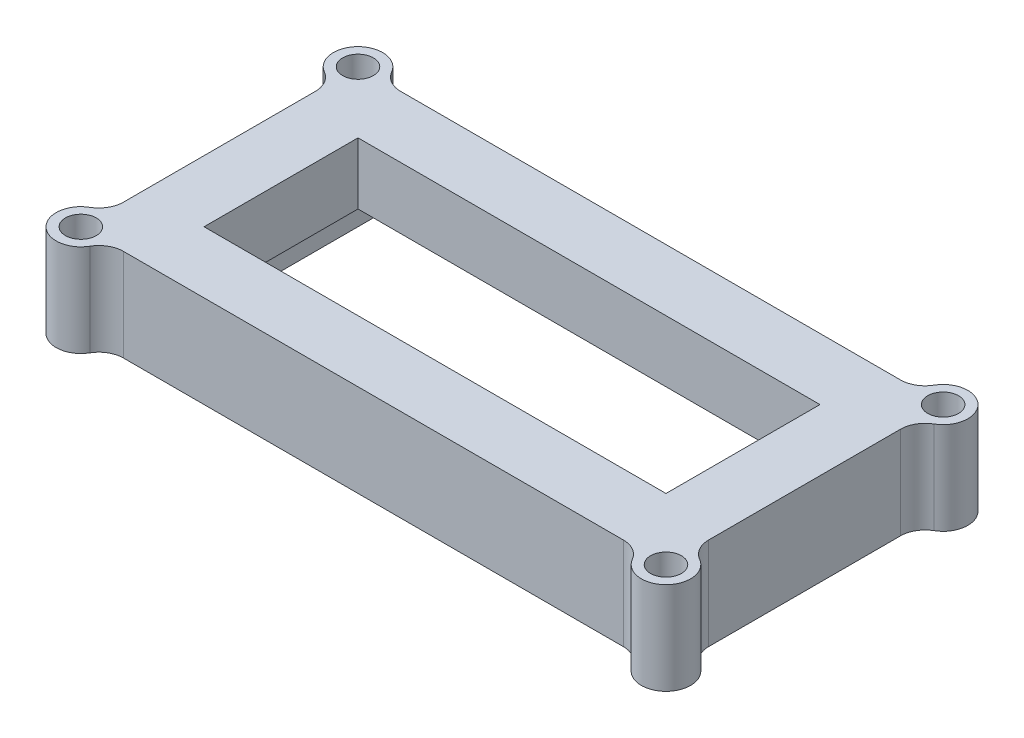
ISO-10303-21;
HEADER;
FILE_DESCRIPTION(('STEP AP214'),'2;1');
FILE_NAME('part.step','',(''),(''),'','','');
FILE_SCHEMA(('AUTOMOTIVE_DESIGN { 1 0 10303 214 1 1 1 1 }'));
ENDSEC;
DATA;
#1=APPLICATION_CONTEXT('core data for automotive mechanical design processes');
#2=APPLICATION_PROTOCOL_DEFINITION('international standard','automotive_design',2000,#1);
#3=PRODUCT_CONTEXT('',#1,'mechanical');
#4=PRODUCT('Part','Part','',(#3));
#5=PRODUCT_RELATED_PRODUCT_CATEGORY('part','',(#4));
#6=PRODUCT_DEFINITION_FORMATION('','',#4);
#7=PRODUCT_DEFINITION_CONTEXT('part definition',#1,'design');
#8=PRODUCT_DEFINITION('design','',#6,#7);
#9=PRODUCT_DEFINITION_SHAPE('','',#8);
#10=(LENGTH_UNIT() NAMED_UNIT(*) SI_UNIT(.MILLI.,.METRE.));
#11=(NAMED_UNIT(*) PLANE_ANGLE_UNIT() SI_UNIT($,.RADIAN.));
#12=(NAMED_UNIT(*) SI_UNIT($,.STERADIAN.) SOLID_ANGLE_UNIT());
#13=UNCERTAINTY_MEASURE_WITH_UNIT(LENGTH_MEASURE(1.E-05),#10,'distance_accuracy_value','');
#14=(GEOMETRIC_REPRESENTATION_CONTEXT(3) GLOBAL_UNCERTAINTY_ASSIGNED_CONTEXT((#13)) GLOBAL_UNIT_ASSIGNED_CONTEXT((#10,
#11,#12)) REPRESENTATION_CONTEXT('',''));
#15=CARTESIAN_POINT('',(0.,0.,0.));
#16=DIRECTION('',(0.,0.,1.));
#17=DIRECTION('',(1.,0.,0.));
#18=AXIS2_PLACEMENT_3D('',#15,#16,#17);
#19=CARTESIAN_POINT('',(0.,15.,-12.5));
#20=DIRECTION('',(0.,0.,-1.));
#21=DIRECTION('',(-1.,0.,0.));
#22=AXIS2_PLACEMENT_3D('',#19,#20,#21);
#23=PLANE('',#22);
#24=DIRECTION('',(-1.,0.,0.));
#25=VECTOR('',#24,1.);
#26=CARTESIAN_POINT('',(0.,5.,-12.5));
#27=LINE('',#26,#25);
#28=CARTESIAN_POINT('',(37.5,5.,-12.5));
#29=VERTEX_POINT('',#28);
#30=CARTESIAN_POINT('',(-37.5,5.,-12.5));
#31=VERTEX_POINT('',#30);
#32=EDGE_CURVE('E56',#29,#31,#27,.T.);
#33=ORIENTED_EDGE('',*,*,#32,.F.);
#34=DIRECTION('',(0.,-1.,0.));
#35=VECTOR('',#34,1.);
#36=CARTESIAN_POINT('',(37.5,15.,-12.5));
#37=LINE('',#36,#35);
#38=CARTESIAN_POINT('',(37.5,15.,-12.5));
#39=VERTEX_POINT('',#38);
#40=EDGE_CURVE('E345',#39,#29,#37,.T.);
#41=ORIENTED_EDGE('',*,*,#40,.F.);
#42=DIRECTION('',(1.,0.,0.));
#43=VECTOR('',#42,1.);
#44=CARTESIAN_POINT('',(0.,15.,-12.5));
#45=LINE('',#44,#43);
#46=CARTESIAN_POINT('',(-37.5,15.,-12.5));
#47=VERTEX_POINT('',#46);
#48=EDGE_CURVE('E292',#47,#39,#45,.T.);
#49=ORIENTED_EDGE('',*,*,#48,.F.);
#50=DIRECTION('',(0.,-1.,0.));
#51=VECTOR('',#50,1.);
#52=CARTESIAN_POINT('',(-37.5,15.,-12.5));
#53=LINE('',#52,#51);
#54=EDGE_CURVE('E303',#47,#31,#53,.T.);
#55=ORIENTED_EDGE('',*,*,#54,.T.);
#56=EDGE_LOOP('',(#33,#41,#49,#55));
#57=FACE_BOUND('',#56,.T.);
#58=ADVANCED_FACE('F41',(#57),#23,.F.);
#59=CARTESIAN_POINT('',(37.5,15.,0.));
#60=DIRECTION('',(1.,0.,0.));
#61=DIRECTION('',(0.,0.,-1.));
#62=AXIS2_PLACEMENT_3D('',#59,#60,#61);
#63=PLANE('',#62);
#64=DIRECTION('',(0.,0.,-1.));
#65=VECTOR('',#64,1.);
#66=CARTESIAN_POINT('',(37.5,5.,0.));
#67=LINE('',#66,#65);
#68=CARTESIAN_POINT('',(37.5,5.,12.5));
#69=VERTEX_POINT('',#68);
#70=EDGE_CURVE('E242',#69,#29,#67,.T.);
#71=ORIENTED_EDGE('',*,*,#70,.F.);
#72=DIRECTION('',(0.,-1.,0.));
#73=VECTOR('',#72,1.);
#74=CARTESIAN_POINT('',(37.5,15.,12.5));
#75=LINE('',#74,#73);
#76=CARTESIAN_POINT('',(37.5,15.,12.5));
#77=VERTEX_POINT('',#76);
#78=EDGE_CURVE('E342',#77,#69,#75,.T.);
#79=ORIENTED_EDGE('',*,*,#78,.F.);
#80=DIRECTION('',(0.,0.,1.));
#81=VECTOR('',#80,1.);
#82=CARTESIAN_POINT('',(37.5,15.,0.));
#83=LINE('',#82,#81);
#84=EDGE_CURVE('E295',#39,#77,#83,.T.);
#85=ORIENTED_EDGE('',*,*,#84,.F.);
#86=ORIENTED_EDGE('',*,*,#40,.T.);
#87=EDGE_LOOP('',(#71,#79,#85,#86));
#88=FACE_BOUND('',#87,.T.);
#89=ADVANCED_FACE('F460',(#88),#63,.F.);
#90=CARTESIAN_POINT('',(0.,15.,12.5));
#91=DIRECTION('',(0.,0.,-1.));
#92=DIRECTION('',(-1.,0.,0.));
#93=AXIS2_PLACEMENT_3D('',#90,#91,#92);
#94=PLANE('',#93);
#95=ORIENTED_EDGE('',*,*,#78,.T.);
#96=DIRECTION('',(-1.,0.,0.));
#97=VECTOR('',#96,1.);
#98=CARTESIAN_POINT('',(0.,5.,12.5));
#99=LINE('',#98,#97);
#100=CARTESIAN_POINT('',(-37.5,5.,12.5));
#101=VERTEX_POINT('',#100);
#102=EDGE_CURVE('E236',#69,#101,#99,.T.);
#103=ORIENTED_EDGE('',*,*,#102,.T.);
#104=DIRECTION('',(0.,-1.,0.));
#105=VECTOR('',#104,1.);
#106=CARTESIAN_POINT('',(-37.5,15.,12.5));
#107=LINE('',#106,#105);
#108=CARTESIAN_POINT('',(-37.5,15.,12.5));
#109=VERTEX_POINT('',#108);
#110=EDGE_CURVE('E339',#109,#101,#107,.T.);
#111=ORIENTED_EDGE('',*,*,#110,.F.);
#112=DIRECTION('',(1.,0.,0.));
#113=VECTOR('',#112,1.);
#114=CARTESIAN_POINT('',(0.,15.,12.5));
#115=LINE('',#114,#113);
#116=EDGE_CURVE('E297',#109,#77,#115,.T.);
#117=ORIENTED_EDGE('',*,*,#116,.T.);
#118=EDGE_LOOP('',(#95,#103,#111,#117));
#119=FACE_BOUND('',#118,.T.);
#120=ADVANCED_FACE('F455',(#119),#94,.T.);
#121=CARTESIAN_POINT('',(-37.5,15.,0.));
#122=DIRECTION('',(1.,0.,0.));
#123=DIRECTION('',(0.,0.,-1.));
#124=AXIS2_PLACEMENT_3D('',#121,#122,#123);
#125=PLANE('',#124);
#126=ORIENTED_EDGE('',*,*,#110,.T.);
#127=DIRECTION('',(0.,0.,-1.));
#128=VECTOR('',#127,1.);
#129=CARTESIAN_POINT('',(-37.5,5.,0.));
#130=LINE('',#129,#128);
#131=EDGE_CURVE('E11',#101,#31,#130,.T.);
#132=ORIENTED_EDGE('',*,*,#131,.T.);
#133=ORIENTED_EDGE('',*,*,#54,.F.);
#134=DIRECTION('',(0.,0.,1.));
#135=VECTOR('',#134,1.);
#136=CARTESIAN_POINT('',(-37.5,15.,0.));
#137=LINE('',#136,#135);
#138=EDGE_CURVE('E300',#47,#109,#137,.T.);
#139=ORIENTED_EDGE('',*,*,#138,.T.);
#140=EDGE_LOOP('',(#126,#132,#133,#139));
#141=FACE_BOUND('',#140,.T.);
#142=ADVANCED_FACE('F445',(#141),#125,.T.);
#143=CARTESIAN_POINT('',(47.5,15.,-22.5));
#144=DIRECTION('',(0.,-1.,0.));
#145=DIRECTION('',(0.,0.,-1.));
#146=AXIS2_PLACEMENT_3D('',#143,#144,#145);
#147=CYLINDRICAL_SURFACE('',#146,1.5);
#148=CARTESIAN_POINT('',(47.5,0.,-22.5));
#149=DIRECTION('',(0.,1.,0.));
#150=DIRECTION('',(0.,0.,1.));
#151=AXIS2_PLACEMENT_3D('',#148,#149,#150);
#152=CIRCLE('',#151,1.5);
#153=CARTESIAN_POINT('',(47.5,0.,-21.));
#154=VERTEX_POINT('',#153);
#155=EDGE_CURVE('E274',#154,#154,#152,.F.);
#156=ORIENTED_EDGE('',*,*,#155,.T.);
#157=EDGE_LOOP('',(#156));
#158=FACE_BOUND('',#157,.T.);
#159=CARTESIAN_POINT('',(47.5,5.,-22.5));
#160=DIRECTION('',(0.,1.,0.));
#161=DIRECTION('',(0.,0.,1.));
#162=AXIS2_PLACEMENT_3D('',#159,#160,#161);
#163=CIRCLE('',#162,1.5);
#164=CARTESIAN_POINT('',(47.5,5.,-21.));
#165=VERTEX_POINT('',#164);
#166=EDGE_CURVE('E308',#165,#165,#163,.F.);
#167=ORIENTED_EDGE('',*,*,#166,.F.);
#168=EDGE_LOOP('',(#167));
#169=FACE_BOUND('',#168,.T.);
#170=ADVANCED_FACE('F442',(#158,#169),#147,.F.);
#171=CARTESIAN_POINT('',(-47.5,15.,-22.5));
#172=DIRECTION('',(0.,-1.,0.));
#173=DIRECTION('',(0.,0.,-1.));
#174=AXIS2_PLACEMENT_3D('',#171,#172,#173);
#175=CYLINDRICAL_SURFACE('',#174,1.5);
#176=CARTESIAN_POINT('',(-47.5,0.,-22.5));
#177=DIRECTION('',(0.,1.,0.));
#178=DIRECTION('',(0.,0.,1.));
#179=AXIS2_PLACEMENT_3D('',#176,#177,#178);
#180=CIRCLE('',#179,1.5);
#181=CARTESIAN_POINT('',(-47.5,0.,-21.));
#182=VERTEX_POINT('',#181);
#183=EDGE_CURVE('E332',#182,#182,#180,.T.);
#184=ORIENTED_EDGE('',*,*,#183,.F.);
#185=EDGE_LOOP('',(#184));
#186=FACE_BOUND('',#185,.T.);
#187=CARTESIAN_POINT('',(-47.5,5.,-22.5));
#188=DIRECTION('',(0.,1.,0.));
#189=DIRECTION('',(0.,0.,1.));
#190=AXIS2_PLACEMENT_3D('',#187,#188,#189);
#191=CIRCLE('',#190,1.5);
#192=CARTESIAN_POINT('',(-47.5,5.,-21.));
#193=VERTEX_POINT('',#192);
#194=EDGE_CURVE('E435',#193,#193,#191,.T.);
#195=ORIENTED_EDGE('',*,*,#194,.T.);
#196=EDGE_LOOP('',(#195));
#197=FACE_BOUND('',#196,.T.);
#198=ADVANCED_FACE('F444',(#186,#197),#175,.F.);
#199=CARTESIAN_POINT('',(-47.5,15.,22.5));
#200=DIRECTION('',(0.,-1.,0.));
#201=DIRECTION('',(0.,0.,-1.));
#202=AXIS2_PLACEMENT_3D('',#199,#200,#201);
#203=CYLINDRICAL_SURFACE('',#202,1.5);
#204=CARTESIAN_POINT('',(-47.5,0.,22.5));
#205=DIRECTION('',(0.,1.,0.));
#206=DIRECTION('',(0.,0.,1.));
#207=AXIS2_PLACEMENT_3D('',#204,#205,#206);
#208=CIRCLE('',#207,1.5);
#209=CARTESIAN_POINT('',(-47.5,0.,24.));
#210=VERTEX_POINT('',#209);
#211=EDGE_CURVE('E329',#210,#210,#208,.F.);
#212=ORIENTED_EDGE('',*,*,#211,.T.);
#213=EDGE_LOOP('',(#212));
#214=FACE_BOUND('',#213,.T.);
#215=CARTESIAN_POINT('',(-47.5,5.,22.5));
#216=DIRECTION('',(0.,1.,0.));
#217=DIRECTION('',(0.,0.,1.));
#218=AXIS2_PLACEMENT_3D('',#215,#216,#217);
#219=CIRCLE('',#218,1.5);
#220=CARTESIAN_POINT('',(-47.5,5.,24.));
#221=VERTEX_POINT('',#220);
#222=EDGE_CURVE('E432',#221,#221,#219,.F.);
#223=ORIENTED_EDGE('',*,*,#222,.F.);
#224=EDGE_LOOP('',(#223));
#225=FACE_BOUND('',#224,.T.);
#226=ADVANCED_FACE('F452',(#214,#225),#203,.F.);
#227=CARTESIAN_POINT('',(47.5,15.,22.5));
#228=DIRECTION('',(0.,-1.,0.));
#229=DIRECTION('',(0.,0.,-1.));
#230=AXIS2_PLACEMENT_3D('',#227,#228,#229);
#231=CYLINDRICAL_SURFACE('',#230,1.5);
#232=CARTESIAN_POINT('',(47.5,0.,22.5));
#233=DIRECTION('',(0.,1.,0.));
#234=DIRECTION('',(0.,0.,1.));
#235=AXIS2_PLACEMENT_3D('',#232,#233,#234);
#236=CIRCLE('',#235,1.5);
#237=CARTESIAN_POINT('',(47.5,0.,24.));
#238=VERTEX_POINT('',#237);
#239=EDGE_CURVE('E304',#238,#238,#236,.T.);
#240=ORIENTED_EDGE('',*,*,#239,.F.);
#241=EDGE_LOOP('',(#240));
#242=FACE_BOUND('',#241,.T.);
#243=CARTESIAN_POINT('',(47.5,5.,22.5));
#244=DIRECTION('',(0.,1.,0.));
#245=DIRECTION('',(0.,0.,1.));
#246=AXIS2_PLACEMENT_3D('',#243,#244,#245);
#247=CIRCLE('',#246,1.5);
#248=CARTESIAN_POINT('',(47.5,5.,24.));
#249=VERTEX_POINT('',#248);
#250=EDGE_CURVE('E267',#249,#249,#247,.T.);
#251=ORIENTED_EDGE('',*,*,#250,.T.);
#252=EDGE_LOOP('',(#251));
#253=FACE_BOUND('',#252,.T.);
#254=ADVANCED_FACE('F632',(#242,#253),#231,.F.);
#255=CARTESIAN_POINT('',(-51.5,15.,15.5717967697245));
#256=DIRECTION('',(0.,-1.,0.));
#257=DIRECTION('',(0.,0.,-1.));
#258=AXIS2_PLACEMENT_3D('',#255,#256,#257);
#259=CYLINDRICAL_SURFACE('',#258,4.);
#260=DIRECTION('',(0.,-1.,0.));
#261=VECTOR('',#260,1.);
#262=CARTESIAN_POINT('',(-47.5,15.,15.5717967697245));
#263=LINE('',#262,#261);
#264=CARTESIAN_POINT('',(-47.5,0.,15.5717967697245));
#265=VERTEX_POINT('',#264);
#266=CARTESIAN_POINT('',(-47.5,15.,15.5717967697245));
#267=VERTEX_POINT('',#266);
#268=EDGE_CURVE('E421',#265,#267,#263,.F.);
#269=ORIENTED_EDGE('',*,*,#268,.F.);
#270=CARTESIAN_POINT('',(-51.5,0.,15.5717967697245));
#271=DIRECTION('',(0.,1.,0.));
#272=DIRECTION('',(0.,0.,1.));
#273=AXIS2_PLACEMENT_3D('',#270,#271,#272);
#274=CIRCLE('',#273,4.);
#275=CARTESIAN_POINT('',(-49.5,0.,19.0358983848623));
#276=VERTEX_POINT('',#275);
#277=EDGE_CURVE('E427',#265,#276,#274,.F.);
#278=ORIENTED_EDGE('',*,*,#277,.T.);
#279=DIRECTION('',(0.,-1.,0.));
#280=VECTOR('',#279,1.);
#281=CARTESIAN_POINT('',(-49.5,15.,19.0358983848623));
#282=LINE('',#281,#280);
#283=CARTESIAN_POINT('',(-49.5,15.,19.0358983848623));
#284=VERTEX_POINT('',#283);
#285=EDGE_CURVE('E424',#284,#276,#282,.T.);
#286=ORIENTED_EDGE('',*,*,#285,.F.);
#287=CARTESIAN_POINT('',(-51.5,15.,15.5717967697245));
#288=DIRECTION('',(0.,1.,0.));
#289=DIRECTION('',(0.,0.,1.));
#290=AXIS2_PLACEMENT_3D('',#287,#288,#289);
#291=CIRCLE('',#290,4.);
#292=EDGE_CURVE('E49',#284,#267,#291,.T.);
#293=ORIENTED_EDGE('',*,*,#292,.T.);
#294=EDGE_LOOP('',(#269,#278,#286,#293));
#295=FACE_BOUND('',#294,.T.);
#296=ADVANCED_FACE('F43',(#295),#259,.F.);
#297=CARTESIAN_POINT('',(-40.5717967697245,15.,26.5));
#298=DIRECTION('',(0.,-1.,0.));
#299=DIRECTION('',(0.,0.,-1.));
#300=AXIS2_PLACEMENT_3D('',#297,#298,#299);
#301=CYLINDRICAL_SURFACE('',#300,4.);
#302=DIRECTION('',(0.,-1.,0.));
#303=VECTOR('',#302,1.);
#304=CARTESIAN_POINT('',(-40.5717967697245,15.,22.5));
#305=LINE('',#304,#303);
#306=CARTESIAN_POINT('',(-40.5717967697245,15.,22.5));
#307=VERTEX_POINT('',#306);
#308=CARTESIAN_POINT('',(-40.5717967697245,0.,22.5));
#309=VERTEX_POINT('',#308);
#310=EDGE_CURVE('E411',#307,#309,#305,.T.);
#311=ORIENTED_EDGE('',*,*,#310,.F.);
#312=CARTESIAN_POINT('',(-40.5717967697245,15.,26.5));
#313=DIRECTION('',(0.,1.,0.));
#314=DIRECTION('',(0.,0.,1.));
#315=AXIS2_PLACEMENT_3D('',#312,#313,#314);
#316=CIRCLE('',#315,4.);
#317=CARTESIAN_POINT('',(-44.0358983848622,15.,24.5));
#318=VERTEX_POINT('',#317);
#319=EDGE_CURVE('E417',#307,#318,#316,.T.);
#320=ORIENTED_EDGE('',*,*,#319,.T.);
#321=DIRECTION('',(0.,-1.,0.));
#322=VECTOR('',#321,1.);
#323=CARTESIAN_POINT('',(-44.0358983848622,15.,24.5));
#324=LINE('',#323,#322);
#325=CARTESIAN_POINT('',(-44.0358983848622,0.,24.5));
#326=VERTEX_POINT('',#325);
#327=EDGE_CURVE('E414',#326,#318,#324,.F.);
#328=ORIENTED_EDGE('',*,*,#327,.F.);
#329=CARTESIAN_POINT('',(-40.5717967697245,0.,26.5));
#330=DIRECTION('',(0.,1.,0.));
#331=DIRECTION('',(0.,0.,1.));
#332=AXIS2_PLACEMENT_3D('',#329,#330,#331);
#333=CIRCLE('',#332,4.);
#334=EDGE_CURVE('E419',#326,#309,#333,.F.);
#335=ORIENTED_EDGE('',*,*,#334,.T.);
#336=EDGE_LOOP('',(#311,#320,#328,#335));
#337=FACE_BOUND('',#336,.T.);
#338=ADVANCED_FACE('F649',(#337),#301,.F.);
#339=CARTESIAN_POINT('',(40.5717967697245,15.,26.5));
#340=DIRECTION('',(0.,-1.,0.));
#341=DIRECTION('',(0.,0.,-1.));
#342=AXIS2_PLACEMENT_3D('',#339,#340,#341);
#343=CYLINDRICAL_SURFACE('',#342,4.);
#344=DIRECTION('',(0.,1.,0.));
#345=VECTOR('',#344,1.);
#346=CARTESIAN_POINT('',(40.5717967697245,15.,22.5));
#347=LINE('',#346,#345);
#348=CARTESIAN_POINT('',(40.5717967697245,0.,22.5));
#349=VERTEX_POINT('',#348);
#350=CARTESIAN_POINT('',(40.5717967697245,15.,22.5));
#351=VERTEX_POINT('',#350);
#352=EDGE_CURVE('E400',#349,#351,#347,.T.);
#353=ORIENTED_EDGE('',*,*,#352,.F.);
#354=CARTESIAN_POINT('',(40.5717967697245,0.,26.5));
#355=DIRECTION('',(0.,1.,0.));
#356=DIRECTION('',(0.,0.,1.));
#357=AXIS2_PLACEMENT_3D('',#354,#355,#356);
#358=CIRCLE('',#357,4.);
#359=CARTESIAN_POINT('',(44.0358983848622,0.,24.5));
#360=VERTEX_POINT('',#359);
#361=EDGE_CURVE('E406',#349,#360,#358,.F.);
#362=ORIENTED_EDGE('',*,*,#361,.T.);
#363=DIRECTION('',(0.,-1.,0.));
#364=VECTOR('',#363,1.);
#365=CARTESIAN_POINT('',(44.0358983848622,15.,24.5));
#366=LINE('',#365,#364);
#367=CARTESIAN_POINT('',(44.0358983848622,15.,24.5));
#368=VERTEX_POINT('',#367);
#369=EDGE_CURVE('E403',#368,#360,#366,.T.);
#370=ORIENTED_EDGE('',*,*,#369,.F.);
#371=CARTESIAN_POINT('',(40.5717967697245,15.,26.5));
#372=DIRECTION('',(0.,1.,0.));
#373=DIRECTION('',(0.,0.,1.));
#374=AXIS2_PLACEMENT_3D('',#371,#372,#373);
#375=CIRCLE('',#374,4.);
#376=EDGE_CURVE('E408',#368,#351,#375,.T.);
#377=ORIENTED_EDGE('',*,*,#376,.T.);
#378=EDGE_LOOP('',(#353,#362,#370,#377));
#379=FACE_BOUND('',#378,.T.);
#380=ADVANCED_FACE('F659',(#379),#343,.F.);
#381=CARTESIAN_POINT('',(51.5,15.,15.5717967697245));
#382=DIRECTION('',(0.,-1.,0.));
#383=DIRECTION('',(0.,0.,-1.));
#384=AXIS2_PLACEMENT_3D('',#381,#382,#383);
#385=CYLINDRICAL_SURFACE('',#384,4.);
#386=DIRECTION('',(0.,-1.,0.));
#387=VECTOR('',#386,1.);
#388=CARTESIAN_POINT('',(47.5,15.,15.5717967697245));
#389=LINE('',#388,#387);
#390=CARTESIAN_POINT('',(47.5,15.,15.5717967697245));
#391=VERTEX_POINT('',#390);
#392=CARTESIAN_POINT('',(47.5,0.,15.5717967697245));
#393=VERTEX_POINT('',#392);
#394=EDGE_CURVE('E389',#391,#393,#389,.T.);
#395=ORIENTED_EDGE('',*,*,#394,.F.);
#396=CARTESIAN_POINT('',(51.5,15.,15.5717967697245));
#397=DIRECTION('',(0.,1.,0.));
#398=DIRECTION('',(0.,0.,1.));
#399=AXIS2_PLACEMENT_3D('',#396,#397,#398);
#400=CIRCLE('',#399,4.);
#401=CARTESIAN_POINT('',(49.5,15.,19.0358983848623));
#402=VERTEX_POINT('',#401);
#403=EDGE_CURVE('E395',#391,#402,#400,.T.);
#404=ORIENTED_EDGE('',*,*,#403,.T.);
#405=DIRECTION('',(0.,-1.,0.));
#406=VECTOR('',#405,1.);
#407=CARTESIAN_POINT('',(49.5,15.,19.0358983848622));
#408=LINE('',#407,#406);
#409=CARTESIAN_POINT('',(49.5,0.,19.0358983848623));
#410=VERTEX_POINT('',#409);
#411=EDGE_CURVE('E392',#410,#402,#408,.F.);
#412=ORIENTED_EDGE('',*,*,#411,.F.);
#413=CARTESIAN_POINT('',(51.5,0.,15.5717967697245));
#414=DIRECTION('',(0.,1.,0.));
#415=DIRECTION('',(0.,0.,1.));
#416=AXIS2_PLACEMENT_3D('',#413,#414,#415);
#417=CIRCLE('',#416,4.);
#418=EDGE_CURVE('E398',#410,#393,#417,.F.);
#419=ORIENTED_EDGE('',*,*,#418,.T.);
#420=EDGE_LOOP('',(#395,#404,#412,#419));
#421=FACE_BOUND('',#420,.T.);
#422=ADVANCED_FACE('F668',(#421),#385,.F.);
#423=CARTESIAN_POINT('',(40.5717967697245,15.,-26.5));
#424=DIRECTION('',(0.,-1.,0.));
#425=DIRECTION('',(0.,0.,-1.));
#426=AXIS2_PLACEMENT_3D('',#423,#424,#425);
#427=CYLINDRICAL_SURFACE('',#426,4.);
#428=DIRECTION('',(0.,1.,0.));
#429=VECTOR('',#428,1.);
#430=CARTESIAN_POINT('',(40.5717967697245,15.,-22.5));
#431=LINE('',#430,#429);
#432=CARTESIAN_POINT('',(40.5717967697245,15.,-22.5));
#433=VERTEX_POINT('',#432);
#434=CARTESIAN_POINT('',(40.5717967697245,0.,-22.5));
#435=VERTEX_POINT('',#434);
#436=EDGE_CURVE('E379',#433,#435,#431,.F.);
#437=ORIENTED_EDGE('',*,*,#436,.F.);
#438=CARTESIAN_POINT('',(40.5717967697245,15.,-26.5));
#439=DIRECTION('',(0.,1.,0.));
#440=DIRECTION('',(0.,0.,1.));
#441=AXIS2_PLACEMENT_3D('',#438,#439,#440);
#442=CIRCLE('',#441,4.);
#443=CARTESIAN_POINT('',(44.0358983848622,15.,-24.5));
#444=VERTEX_POINT('',#443);
#445=EDGE_CURVE('E385',#433,#444,#442,.T.);
#446=ORIENTED_EDGE('',*,*,#445,.T.);
#447=DIRECTION('',(0.,-1.,0.));
#448=VECTOR('',#447,1.);
#449=CARTESIAN_POINT('',(44.0358983848622,15.,-24.5));
#450=LINE('',#449,#448);
#451=CARTESIAN_POINT('',(44.0358983848622,0.,-24.5));
#452=VERTEX_POINT('',#451);
#453=EDGE_CURVE('E382',#452,#444,#450,.F.);
#454=ORIENTED_EDGE('',*,*,#453,.F.);
#455=CARTESIAN_POINT('',(40.5717967697245,0.,-26.5));
#456=DIRECTION('',(0.,1.,0.));
#457=DIRECTION('',(0.,0.,1.));
#458=AXIS2_PLACEMENT_3D('',#455,#456,#457);
#459=CIRCLE('',#458,4.);
#460=EDGE_CURVE('E387',#452,#435,#459,.F.);
#461=ORIENTED_EDGE('',*,*,#460,.T.);
#462=EDGE_LOOP('',(#437,#446,#454,#461));
#463=FACE_BOUND('',#462,.T.);
#464=ADVANCED_FACE('F678',(#463),#427,.F.);
#465=CARTESIAN_POINT('',(51.5,15.,-15.5717967697245));
#466=DIRECTION('',(0.,-1.,0.));
#467=DIRECTION('',(0.,0.,-1.));
#468=AXIS2_PLACEMENT_3D('',#465,#466,#467);
#469=CYLINDRICAL_SURFACE('',#468,4.);
#470=DIRECTION('',(0.,1.,0.));
#471=VECTOR('',#470,1.);
#472=CARTESIAN_POINT('',(47.5,15.,-15.5717967697245));
#473=LINE('',#472,#471);
#474=CARTESIAN_POINT('',(47.5,0.,-15.5717967697245));
#475=VERTEX_POINT('',#474);
#476=CARTESIAN_POINT('',(47.5,15.,-15.5717967697245));
#477=VERTEX_POINT('',#476);
#478=EDGE_CURVE('E368',#475,#477,#473,.T.);
#479=ORIENTED_EDGE('',*,*,#478,.F.);
#480=CARTESIAN_POINT('',(51.5,0.,-15.5717967697245));
#481=DIRECTION('',(0.,1.,0.));
#482=DIRECTION('',(0.,0.,1.));
#483=AXIS2_PLACEMENT_3D('',#480,#481,#482);
#484=CIRCLE('',#483,4.);
#485=CARTESIAN_POINT('',(49.5,0.,-19.0358983848623));
#486=VERTEX_POINT('',#485);
#487=EDGE_CURVE('E374',#475,#486,#484,.F.);
#488=ORIENTED_EDGE('',*,*,#487,.T.);
#489=DIRECTION('',(0.,-1.,0.));
#490=VECTOR('',#489,1.);
#491=CARTESIAN_POINT('',(49.5,15.,-19.0358983848623));
#492=LINE('',#491,#490);
#493=CARTESIAN_POINT('',(49.5,15.,-19.0358983848623));
#494=VERTEX_POINT('',#493);
#495=EDGE_CURVE('E371',#494,#486,#492,.T.);
#496=ORIENTED_EDGE('',*,*,#495,.F.);
#497=CARTESIAN_POINT('',(51.5,15.,-15.5717967697245));
#498=DIRECTION('',(0.,1.,0.));
#499=DIRECTION('',(0.,0.,1.));
#500=AXIS2_PLACEMENT_3D('',#497,#498,#499);
#501=CIRCLE('',#500,4.);
#502=EDGE_CURVE('E377',#494,#477,#501,.T.);
#503=ORIENTED_EDGE('',*,*,#502,.T.);
#504=EDGE_LOOP('',(#479,#488,#496,#503));
#505=FACE_BOUND('',#504,.T.);
#506=ADVANCED_FACE('F688',(#505),#469,.F.);
#507=CARTESIAN_POINT('',(-51.5,15.,-15.5717967697245));
#508=DIRECTION('',(0.,-1.,0.));
#509=DIRECTION('',(0.,0.,-1.));
#510=AXIS2_PLACEMENT_3D('',#507,#508,#509);
#511=CYLINDRICAL_SURFACE('',#510,4.);
#512=DIRECTION('',(0.,1.,0.));
#513=VECTOR('',#512,1.);
#514=CARTESIAN_POINT('',(-47.5,15.,-15.5717967697245));
#515=LINE('',#514,#513);
#516=CARTESIAN_POINT('',(-47.5,15.,-15.5717967697245));
#517=VERTEX_POINT('',#516);
#518=CARTESIAN_POINT('',(-47.5,0.,-15.5717967697245));
#519=VERTEX_POINT('',#518);
#520=EDGE_CURVE('E358',#517,#519,#515,.F.);
#521=ORIENTED_EDGE('',*,*,#520,.F.);
#522=CARTESIAN_POINT('',(-51.5,15.,-15.5717967697245));
#523=DIRECTION('',(0.,1.,0.));
#524=DIRECTION('',(0.,0.,1.));
#525=AXIS2_PLACEMENT_3D('',#522,#523,#524);
#526=CIRCLE('',#525,4.);
#527=CARTESIAN_POINT('',(-49.5,15.,-19.0358983848622));
#528=VERTEX_POINT('',#527);
#529=EDGE_CURVE('E364',#517,#528,#526,.T.);
#530=ORIENTED_EDGE('',*,*,#529,.T.);
#531=DIRECTION('',(0.,-1.,0.));
#532=VECTOR('',#531,1.);
#533=CARTESIAN_POINT('',(-49.5,15.,-19.0358983848622));
#534=LINE('',#533,#532);
#535=CARTESIAN_POINT('',(-49.5,0.,-19.0358983848622));
#536=VERTEX_POINT('',#535);
#537=EDGE_CURVE('E361',#536,#528,#534,.F.);
#538=ORIENTED_EDGE('',*,*,#537,.F.);
#539=CARTESIAN_POINT('',(-51.5,0.,-15.5717967697245));
#540=DIRECTION('',(0.,1.,0.));
#541=DIRECTION('',(0.,0.,1.));
#542=AXIS2_PLACEMENT_3D('',#539,#540,#541);
#543=CIRCLE('',#542,4.);
#544=EDGE_CURVE('E366',#536,#519,#543,.F.);
#545=ORIENTED_EDGE('',*,*,#544,.T.);
#546=EDGE_LOOP('',(#521,#530,#538,#545));
#547=FACE_BOUND('',#546,.T.);
#548=ADVANCED_FACE('F698',(#547),#511,.F.);
#549=CARTESIAN_POINT('',(-40.5717967697198,0.,-26.5000000000082));
#550=DIRECTION('',(0.,1.,0.));
#551=DIRECTION('',(0.,0.,1.));
#552=AXIS2_PLACEMENT_3D('',#549,#550,#551);
#553=CYLINDRICAL_SURFACE('',#552,4.00000000000816);
#554=DIRECTION('',(0.,1.,0.));
#555=VECTOR('',#554,1.);
#556=CARTESIAN_POINT('',(-40.5717967697198,15.,-22.5));
#557=LINE('',#556,#555);
#558=CARTESIAN_POINT('',(-40.5717967697198,0.,-22.5));
#559=VERTEX_POINT('',#558);
#560=CARTESIAN_POINT('',(-40.5717967697198,15.,-22.5));
#561=VERTEX_POINT('',#560);
#562=EDGE_CURVE('E348',#559,#561,#557,.T.);
#563=ORIENTED_EDGE('',*,*,#562,.F.);
#564=CARTESIAN_POINT('',(-40.5717967697198,0.,-26.5000000000082));
#565=DIRECTION('',(0.,1.,0.));
#566=DIRECTION('',(0.,0.,1.));
#567=AXIS2_PLACEMENT_3D('',#564,#565,#566);
#568=CIRCLE('',#567,4.00000000000816);
#569=CARTESIAN_POINT('',(-44.0358983848565,0.,-24.49999999999));
#570=VERTEX_POINT('',#569);
#571=EDGE_CURVE('E354',#559,#570,#568,.F.);
#572=ORIENTED_EDGE('',*,*,#571,.T.);
#573=DIRECTION('',(0.,-1.,0.));
#574=VECTOR('',#573,1.);
#575=CARTESIAN_POINT('',(-44.0358983848634,15.,-24.500000000002));
#576=LINE('',#575,#574);
#577=CARTESIAN_POINT('',(-44.0358983848565,15.,-24.49999999999));
#578=VERTEX_POINT('',#577);
#579=EDGE_CURVE('E351',#578,#570,#576,.T.);
#580=ORIENTED_EDGE('',*,*,#579,.F.);
#581=CARTESIAN_POINT('',(-40.5717967697198,15.,-26.5000000000082));
#582=DIRECTION('',(0.,1.,0.));
#583=DIRECTION('',(0.,0.,1.));
#584=AXIS2_PLACEMENT_3D('',#581,#582,#583);
#585=CIRCLE('',#584,4.00000000000816);
#586=EDGE_CURVE('E356',#578,#561,#585,.T.);
#587=ORIENTED_EDGE('',*,*,#586,.T.);
#588=EDGE_LOOP('',(#563,#572,#580,#587));
#589=FACE_BOUND('',#588,.T.);
#590=ADVANCED_FACE('F708',(#589),#553,.F.);
#591=CARTESIAN_POINT('',(-47.5,15.,-22.5));
#592=DIRECTION('',(0.,-1.,0.));
#593=DIRECTION('',(0.,0.,-1.));
#594=AXIS2_PLACEMENT_3D('',#591,#592,#593);
#595=CYLINDRICAL_SURFACE('',#594,4.00000000000001);
#596=CARTESIAN_POINT('',(-47.5,0.,-22.5));
#597=DIRECTION('',(0.,1.,0.));
#598=DIRECTION('',(0.,0.,1.));
#599=AXIS2_PLACEMENT_3D('',#596,#597,#598);
#600=CIRCLE('',#599,4.00000000000001);
#601=EDGE_CURVE('E307',#570,#536,#600,.T.);
#602=ORIENTED_EDGE('',*,*,#601,.T.);
#603=ORIENTED_EDGE('',*,*,#537,.T.);
#604=CARTESIAN_POINT('',(-47.5,15.,-22.5));
#605=DIRECTION('',(0.,1.,0.));
#606=DIRECTION('',(0.,0.,1.));
#607=AXIS2_PLACEMENT_3D('',#604,#605,#606);
#608=CIRCLE('',#607,4.00000000000001);
#609=EDGE_CURVE('E270',#578,#528,#608,.T.);
#610=ORIENTED_EDGE('',*,*,#609,.F.);
#611=ORIENTED_EDGE('',*,*,#579,.T.);
#612=EDGE_LOOP('',(#602,#603,#610,#611));
#613=FACE_BOUND('',#612,.T.);
#614=ADVANCED_FACE('F717',(#613),#595,.T.);
#615=CARTESIAN_POINT('',(-47.5,15.,0.));
#616=DIRECTION('',(1.,0.,0.));
#617=DIRECTION('',(0.,0.,-1.));
#618=AXIS2_PLACEMENT_3D('',#615,#616,#617);
#619=PLANE('',#618);
#620=DIRECTION('',(0.,0.,1.));
#621=VECTOR('',#620,1.);
#622=CARTESIAN_POINT('',(-47.5,0.,0.));
#623=LINE('',#622,#621);
#624=EDGE_CURVE('E311',#519,#265,#623,.T.);
#625=ORIENTED_EDGE('',*,*,#624,.T.);
#626=ORIENTED_EDGE('',*,*,#268,.T.);
#627=DIRECTION('',(0.,0.,1.));
#628=VECTOR('',#627,1.);
#629=CARTESIAN_POINT('',(-47.5,15.,0.));
#630=LINE('',#629,#628);
#631=EDGE_CURVE('E273',#517,#267,#630,.T.);
#632=ORIENTED_EDGE('',*,*,#631,.F.);
#633=ORIENTED_EDGE('',*,*,#520,.T.);
#634=EDGE_LOOP('',(#625,#626,#632,#633));
#635=FACE_BOUND('',#634,.T.);
#636=ADVANCED_FACE('F777',(#635),#619,.F.);
#637=CARTESIAN_POINT('',(-47.5,15.,22.5));
#638=DIRECTION('',(0.,-1.,0.));
#639=DIRECTION('',(0.,0.,-1.));
#640=AXIS2_PLACEMENT_3D('',#637,#638,#639);
#641=CYLINDRICAL_SURFACE('',#640,4.);
#642=CARTESIAN_POINT('',(-47.5,15.,22.5));
#643=DIRECTION('',(0.,1.,0.));
#644=DIRECTION('',(0.,0.,1.));
#645=AXIS2_PLACEMENT_3D('',#642,#643,#644);
#646=CIRCLE('',#645,4.);
#647=EDGE_CURVE('E277',#318,#284,#646,.F.);
#648=ORIENTED_EDGE('',*,*,#647,.T.);
#649=ORIENTED_EDGE('',*,*,#285,.T.);
#650=CARTESIAN_POINT('',(-47.5,0.,22.5));
#651=DIRECTION('',(0.,1.,0.));
#652=DIRECTION('',(0.,0.,1.));
#653=AXIS2_PLACEMENT_3D('',#650,#651,#652);
#654=CIRCLE('',#653,4.);
#655=EDGE_CURVE('E314',#326,#276,#654,.F.);
#656=ORIENTED_EDGE('',*,*,#655,.F.);
#657=ORIENTED_EDGE('',*,*,#327,.T.);
#658=EDGE_LOOP('',(#648,#649,#656,#657));
#659=FACE_BOUND('',#658,.T.);
#660=ADVANCED_FACE('F770',(#659),#641,.T.);
#661=CARTESIAN_POINT('',(0.,15.,22.5));
#662=DIRECTION('',(0.,0.,-1.));
#663=DIRECTION('',(-1.,0.,0.));
#664=AXIS2_PLACEMENT_3D('',#661,#662,#663);
#665=PLANE('',#664);
#666=DIRECTION('',(1.,0.,0.));
#667=VECTOR('',#666,1.);
#668=CARTESIAN_POINT('',(0.,15.,22.5));
#669=LINE('',#668,#667);
#670=EDGE_CURVE('E280',#307,#351,#669,.T.);
#671=ORIENTED_EDGE('',*,*,#670,.F.);
#672=ORIENTED_EDGE('',*,*,#310,.T.);
#673=DIRECTION('',(1.,0.,0.));
#674=VECTOR('',#673,1.);
#675=CARTESIAN_POINT('',(0.,0.,22.5));
#676=LINE('',#675,#674);
#677=EDGE_CURVE('E317',#309,#349,#676,.T.);
#678=ORIENTED_EDGE('',*,*,#677,.T.);
#679=ORIENTED_EDGE('',*,*,#352,.T.);
#680=EDGE_LOOP('',(#671,#672,#678,#679));
#681=FACE_BOUND('',#680,.T.);
#682=ADVANCED_FACE('F763',(#681),#665,.F.);
#683=CARTESIAN_POINT('',(47.5,15.,22.5));
#684=DIRECTION('',(0.,-1.,0.));
#685=DIRECTION('',(0.,0.,-1.));
#686=AXIS2_PLACEMENT_3D('',#683,#684,#685);
#687=CYLINDRICAL_SURFACE('',#686,4.);
#688=CARTESIAN_POINT('',(47.5,15.,22.5));
#689=DIRECTION('',(0.,1.,0.));
#690=DIRECTION('',(0.,0.,1.));
#691=AXIS2_PLACEMENT_3D('',#688,#689,#690);
#692=CIRCLE('',#691,4.);
#693=EDGE_CURVE('E282',#368,#402,#692,.T.);
#694=ORIENTED_EDGE('',*,*,#693,.F.);
#695=ORIENTED_EDGE('',*,*,#369,.T.);
#696=CARTESIAN_POINT('',(47.5,0.,22.5));
#697=DIRECTION('',(0.,1.,0.));
#698=DIRECTION('',(0.,0.,1.));
#699=AXIS2_PLACEMENT_3D('',#696,#697,#698);
#700=CIRCLE('',#699,4.);
#701=EDGE_CURVE('E319',#360,#410,#700,.T.);
#702=ORIENTED_EDGE('',*,*,#701,.T.);
#703=ORIENTED_EDGE('',*,*,#411,.T.);
#704=EDGE_LOOP('',(#694,#695,#702,#703));
#705=FACE_BOUND('',#704,.T.);
#706=ADVANCED_FACE('F756',(#705),#687,.T.);
#707=CARTESIAN_POINT('',(47.5,15.,0.));
#708=DIRECTION('',(1.,0.,0.));
#709=DIRECTION('',(0.,0.,-1.));
#710=AXIS2_PLACEMENT_3D('',#707,#708,#709);
#711=PLANE('',#710);
#712=DIRECTION('',(0.,0.,1.));
#713=VECTOR('',#712,1.);
#714=CARTESIAN_POINT('',(47.5,15.,0.));
#715=LINE('',#714,#713);
#716=EDGE_CURVE('E284',#477,#391,#715,.T.);
#717=ORIENTED_EDGE('',*,*,#716,.T.);
#718=ORIENTED_EDGE('',*,*,#394,.T.);
#719=DIRECTION('',(0.,0.,1.));
#720=VECTOR('',#719,1.);
#721=CARTESIAN_POINT('',(47.5,0.,0.));
#722=LINE('',#721,#720);
#723=EDGE_CURVE('E321',#475,#393,#722,.T.);
#724=ORIENTED_EDGE('',*,*,#723,.F.);
#725=ORIENTED_EDGE('',*,*,#478,.T.);
#726=EDGE_LOOP('',(#717,#718,#724,#725));
#727=FACE_BOUND('',#726,.T.);
#728=ADVANCED_FACE('F749',(#727),#711,.T.);
#729=CARTESIAN_POINT('',(47.5,15.,-22.5));
#730=DIRECTION('',(0.,-1.,0.));
#731=DIRECTION('',(0.,0.,-1.));
#732=AXIS2_PLACEMENT_3D('',#729,#730,#731);
#733=CYLINDRICAL_SURFACE('',#732,4.);
#734=CARTESIAN_POINT('',(47.5,0.,-22.5));
#735=DIRECTION('',(0.,1.,0.));
#736=DIRECTION('',(0.,0.,1.));
#737=AXIS2_PLACEMENT_3D('',#734,#735,#736);
#738=CIRCLE('',#737,4.);
#739=EDGE_CURVE('E324',#452,#486,#738,.F.);
#740=ORIENTED_EDGE('',*,*,#739,.F.);
#741=ORIENTED_EDGE('',*,*,#453,.T.);
#742=CARTESIAN_POINT('',(47.5,15.,-22.5));
#743=DIRECTION('',(0.,1.,0.));
#744=DIRECTION('',(0.,0.,1.));
#745=AXIS2_PLACEMENT_3D('',#742,#743,#744);
#746=CIRCLE('',#745,4.);
#747=EDGE_CURVE('E287',#444,#494,#746,.F.);
#748=ORIENTED_EDGE('',*,*,#747,.T.);
#749=ORIENTED_EDGE('',*,*,#495,.T.);
#750=EDGE_LOOP('',(#740,#741,#748,#749));
#751=FACE_BOUND('',#750,.T.);
#752=ADVANCED_FACE('F742',(#751),#733,.T.);
#753=CARTESIAN_POINT('',(0.,15.,-22.5));
#754=DIRECTION('',(0.,0.,-1.));
#755=DIRECTION('',(-1.,0.,0.));
#756=AXIS2_PLACEMENT_3D('',#753,#754,#755);
#757=PLANE('',#756);
#758=DIRECTION('',(1.,0.,0.));
#759=VECTOR('',#758,1.);
#760=CARTESIAN_POINT('',(0.,15.,-22.5));
#761=LINE('',#760,#759);
#762=EDGE_CURVE('E289',#561,#433,#761,.T.);
#763=ORIENTED_EDGE('',*,*,#762,.T.);
#764=ORIENTED_EDGE('',*,*,#436,.T.);
#765=DIRECTION('',(1.,0.,0.));
#766=VECTOR('',#765,1.);
#767=CARTESIAN_POINT('',(0.,0.,-22.5));
#768=LINE('',#767,#766);
#769=EDGE_CURVE('E326',#559,#435,#768,.T.);
#770=ORIENTED_EDGE('',*,*,#769,.F.);
#771=ORIENTED_EDGE('',*,*,#562,.T.);
#772=EDGE_LOOP('',(#763,#764,#770,#771));
#773=FACE_BOUND('',#772,.T.);
#774=ADVANCED_FACE('F479',(#773),#757,.T.);
#775=CARTESIAN_POINT('',(0.,15.,0.));
#776=DIRECTION('',(0.,1.,0.));
#777=DIRECTION('',(0.,0.,1.));
#778=AXIS2_PLACEMENT_3D('',#775,#776,#777);
#779=PLANE('',#778);
#780=CARTESIAN_POINT('',(-47.5,15.,22.5));
#781=DIRECTION('',(0.,1.,0.));
#782=DIRECTION('',(0.,0.,1.));
#783=AXIS2_PLACEMENT_3D('',#780,#781,#782);
#784=CIRCLE('',#783,2.5);
#785=CARTESIAN_POINT('',(-47.5,15.,25.));
#786=VERTEX_POINT('',#785);
#787=EDGE_CURVE('E245',#786,#786,#784,.T.);
#788=ORIENTED_EDGE('',*,*,#787,.F.);
#789=EDGE_LOOP('',(#788));
#790=FACE_BOUND('',#789,.T.);
#791=CARTESIAN_POINT('',(47.5,15.,22.5));
#792=DIRECTION('',(0.,1.,0.));
#793=DIRECTION('',(0.,0.,1.));
#794=AXIS2_PLACEMENT_3D('',#791,#792,#793);
#795=CIRCLE('',#794,2.5);
#796=CARTESIAN_POINT('',(47.5,15.,25.));
#797=VERTEX_POINT('',#796);
#798=EDGE_CURVE('E256',#797,#797,#795,.T.);
#799=ORIENTED_EDGE('',*,*,#798,.F.);
#800=EDGE_LOOP('',(#799));
#801=FACE_BOUND('',#800,.T.);
#802=CARTESIAN_POINT('',(47.5,15.,-22.5));
#803=DIRECTION('',(0.,1.,0.));
#804=DIRECTION('',(0.,0.,1.));
#805=AXIS2_PLACEMENT_3D('',#802,#803,#804);
#806=CIRCLE('',#805,2.5);
#807=CARTESIAN_POINT('',(47.5,15.,-20.));
#808=VERTEX_POINT('',#807);
#809=EDGE_CURVE('E250',#808,#808,#806,.T.);
#810=ORIENTED_EDGE('',*,*,#809,.F.);
#811=EDGE_LOOP('',(#810));
#812=FACE_BOUND('',#811,.T.);
#813=CARTESIAN_POINT('',(-47.5,15.,-22.5));
#814=DIRECTION('',(0.,1.,0.));
#815=DIRECTION('',(0.,0.,1.));
#816=AXIS2_PLACEMENT_3D('',#813,#814,#815);
#817=CIRCLE('',#816,2.5);
#818=CARTESIAN_POINT('',(-47.5,15.,-20.));
#819=VERTEX_POINT('',#818);
#820=EDGE_CURVE('E249',#819,#819,#817,.T.);
#821=ORIENTED_EDGE('',*,*,#820,.F.);
#822=EDGE_LOOP('',(#821));
#823=FACE_BOUND('',#822,.T.);
#824=ORIENTED_EDGE('',*,*,#319,.F.);
#825=ORIENTED_EDGE('',*,*,#670,.T.);
#826=ORIENTED_EDGE('',*,*,#376,.F.);
#827=ORIENTED_EDGE('',*,*,#693,.T.);
#828=ORIENTED_EDGE('',*,*,#403,.F.);
#829=ORIENTED_EDGE('',*,*,#716,.F.);
#830=ORIENTED_EDGE('',*,*,#502,.F.);
#831=ORIENTED_EDGE('',*,*,#747,.F.);
#832=ORIENTED_EDGE('',*,*,#445,.F.);
#833=ORIENTED_EDGE('',*,*,#762,.F.);
#834=ORIENTED_EDGE('',*,*,#586,.F.);
#835=ORIENTED_EDGE('',*,*,#609,.T.);
#836=ORIENTED_EDGE('',*,*,#529,.F.);
#837=ORIENTED_EDGE('',*,*,#631,.T.);
#838=ORIENTED_EDGE('',*,*,#292,.F.);
#839=ORIENTED_EDGE('',*,*,#647,.F.);
#840=EDGE_LOOP('',(#824,#825,#826,#827,#828,#829,#830,#831,#832,#833,#834,#835,#836,#837,#838,#839));
#841=FACE_BOUND('',#840,.T.);
#842=ORIENTED_EDGE('',*,*,#48,.T.);
#843=ORIENTED_EDGE('',*,*,#84,.T.);
#844=ORIENTED_EDGE('',*,*,#116,.F.);
#845=ORIENTED_EDGE('',*,*,#138,.F.);
#846=EDGE_LOOP('',(#842,#843,#844,#845));
#847=FACE_BOUND('',#846,.T.);
#848=ADVANCED_FACE('F475',(#790,#801,#812,#823,#841,#847),#779,.T.);
#849=CARTESIAN_POINT('',(0.,0.,0.));
#850=DIRECTION('',(0.,1.,0.));
#851=DIRECTION('',(0.,0.,1.));
#852=AXIS2_PLACEMENT_3D('',#849,#850,#851);
#853=PLANE('',#852);
#854=DIRECTION('',(-1.,0.,0.));
#855=VECTOR('',#854,1.);
#856=CARTESIAN_POINT('',(-40.,0.,18.));
#857=LINE('',#856,#855);
#858=CARTESIAN_POINT('',(40.,0.,18.));
#859=VERTEX_POINT('',#858);
#860=CARTESIAN_POINT('',(-40.,0.,18.));
#861=VERTEX_POINT('',#860);
#862=EDGE_CURVE('E230',#859,#861,#857,.T.);
#863=ORIENTED_EDGE('',*,*,#862,.F.);
#864=DIRECTION('',(0.,0.,1.));
#865=VECTOR('',#864,1.);
#866=CARTESIAN_POINT('',(40.,0.,18.));
#867=LINE('',#866,#865);
#868=CARTESIAN_POINT('',(40.,0.,-18.));
#869=VERTEX_POINT('',#868);
#870=EDGE_CURVE('E63',#869,#859,#867,.T.);
#871=ORIENTED_EDGE('',*,*,#870,.F.);
#872=DIRECTION('',(1.,0.,0.));
#873=VECTOR('',#872,1.);
#874=CARTESIAN_POINT('',(-40.,0.,-18.));
#875=LINE('',#874,#873);
#876=CARTESIAN_POINT('',(-40.,0.,-18.));
#877=VERTEX_POINT('',#876);
#878=EDGE_CURVE('E221',#877,#869,#875,.T.);
#879=ORIENTED_EDGE('',*,*,#878,.F.);
#880=DIRECTION('',(0.,0.,-1.));
#881=VECTOR('',#880,1.);
#882=CARTESIAN_POINT('',(-40.,0.,18.));
#883=LINE('',#882,#881);
#884=EDGE_CURVE('E224',#861,#877,#883,.T.);
#885=ORIENTED_EDGE('',*,*,#884,.F.);
#886=EDGE_LOOP('',(#863,#871,#879,#885));
#887=FACE_BOUND('',#886,.T.);
#888=ORIENTED_EDGE('',*,*,#334,.F.);
#889=ORIENTED_EDGE('',*,*,#655,.T.);
#890=ORIENTED_EDGE('',*,*,#277,.F.);
#891=ORIENTED_EDGE('',*,*,#624,.F.);
#892=ORIENTED_EDGE('',*,*,#544,.F.);
#893=ORIENTED_EDGE('',*,*,#601,.F.);
#894=ORIENTED_EDGE('',*,*,#571,.F.);
#895=ORIENTED_EDGE('',*,*,#769,.T.);
#896=ORIENTED_EDGE('',*,*,#460,.F.);
#897=ORIENTED_EDGE('',*,*,#739,.T.);
#898=ORIENTED_EDGE('',*,*,#487,.F.);
#899=ORIENTED_EDGE('',*,*,#723,.T.);
#900=ORIENTED_EDGE('',*,*,#418,.F.);
#901=ORIENTED_EDGE('',*,*,#701,.F.);
#902=ORIENTED_EDGE('',*,*,#361,.F.);
#903=ORIENTED_EDGE('',*,*,#677,.F.);
#904=EDGE_LOOP('',(#888,#889,#890,#891,#892,#893,#894,#895,#896,#897,#898,#899,#900,#901,#902,#903));
#905=FACE_BOUND('',#904,.T.);
#906=ORIENTED_EDGE('',*,*,#239,.T.);
#907=EDGE_LOOP('',(#906));
#908=FACE_BOUND('',#907,.T.);
#909=ORIENTED_EDGE('',*,*,#211,.F.);
#910=EDGE_LOOP('',(#909));
#911=FACE_BOUND('',#910,.T.);
#912=ORIENTED_EDGE('',*,*,#183,.T.);
#913=EDGE_LOOP('',(#912));
#914=FACE_BOUND('',#913,.T.);
#915=ORIENTED_EDGE('',*,*,#155,.F.);
#916=EDGE_LOOP('',(#915));
#917=FACE_BOUND('',#916,.T.);
#918=ADVANCED_FACE('F471',(#887,#905,#908,#911,#914,#917),#853,.F.);
#919=CARTESIAN_POINT('',(-47.5,5.,-22.5));
#920=DIRECTION('',(0.,1.,0.));
#921=DIRECTION('',(0.,0.,1.));
#922=AXIS2_PLACEMENT_3D('',#919,#920,#921);
#923=CYLINDRICAL_SURFACE('',#922,2.5);
#924=CARTESIAN_POINT('',(-47.5,5.,-22.5));
#925=DIRECTION('',(0.,1.,0.));
#926=DIRECTION('',(0.,0.,1.));
#927=AXIS2_PLACEMENT_3D('',#924,#925,#926);
#928=CIRCLE('',#927,2.5);
#929=CARTESIAN_POINT('',(-47.5,5.,-20.));
#930=VERTEX_POINT('',#929);
#931=EDGE_CURVE('E264',#930,#930,#928,.T.);
#932=ORIENTED_EDGE('',*,*,#931,.F.);
#933=EDGE_LOOP('',(#932));
#934=FACE_BOUND('',#933,.T.);
#935=ORIENTED_EDGE('',*,*,#820,.T.);
#936=EDGE_LOOP('',(#935));
#937=FACE_BOUND('',#936,.T.);
#938=ADVANCED_FACE('F474',(#934,#937),#923,.F.);
#939=CARTESIAN_POINT('',(-47.5,5.,-22.5));
#940=DIRECTION('',(0.,1.,0.));
#941=DIRECTION('',(0.,0.,1.));
#942=AXIS2_PLACEMENT_3D('',#939,#940,#941);
#943=PLANE('',#942);
#944=ORIENTED_EDGE('',*,*,#194,.F.);
#945=EDGE_LOOP('',(#944));
#946=FACE_BOUND('',#945,.T.);
#947=ORIENTED_EDGE('',*,*,#931,.T.);
#948=EDGE_LOOP('',(#947));
#949=FACE_BOUND('',#948,.T.);
#950=ADVANCED_FACE('F483',(#946,#949),#943,.T.);
#951=CARTESIAN_POINT('',(47.5,5.,-22.5));
#952=DIRECTION('',(0.,1.,0.));
#953=DIRECTION('',(0.,0.,1.));
#954=AXIS2_PLACEMENT_3D('',#951,#952,#953);
#955=PLANE('',#954);
#956=CARTESIAN_POINT('',(47.5,5.,-22.5));
#957=DIRECTION('',(0.,1.,0.));
#958=DIRECTION('',(0.,0.,1.));
#959=AXIS2_PLACEMENT_3D('',#956,#957,#958);
#960=CIRCLE('',#959,2.5);
#961=CARTESIAN_POINT('',(47.5,5.,-20.));
#962=VERTEX_POINT('',#961);
#963=EDGE_CURVE('E246',#962,#962,#960,.T.);
#964=ORIENTED_EDGE('',*,*,#963,.T.);
#965=EDGE_LOOP('',(#964));
#966=FACE_BOUND('',#965,.T.);
#967=ORIENTED_EDGE('',*,*,#166,.T.);
#968=EDGE_LOOP('',(#967));
#969=FACE_BOUND('',#968,.T.);
#970=ADVANCED_FACE('F440',(#966,#969),#955,.T.);
#971=CARTESIAN_POINT('',(47.5,5.,-22.5));
#972=DIRECTION('',(0.,1.,0.));
#973=DIRECTION('',(0.,0.,1.));
#974=AXIS2_PLACEMENT_3D('',#971,#972,#973);
#975=CYLINDRICAL_SURFACE('',#974,2.5);
#976=ORIENTED_EDGE('',*,*,#963,.F.);
#977=EDGE_LOOP('',(#976));
#978=FACE_BOUND('',#977,.T.);
#979=ORIENTED_EDGE('',*,*,#809,.T.);
#980=EDGE_LOOP('',(#979));
#981=FACE_BOUND('',#980,.T.);
#982=ADVANCED_FACE('F500',(#978,#981),#975,.F.);
#983=CARTESIAN_POINT('',(47.5,5.,22.5));
#984=DIRECTION('',(0.,1.,0.));
#985=DIRECTION('',(0.,0.,1.));
#986=AXIS2_PLACEMENT_3D('',#983,#984,#985);
#987=CYLINDRICAL_SURFACE('',#986,2.5);
#988=CARTESIAN_POINT('',(47.5,5.,22.5));
#989=DIRECTION('',(0.,1.,0.));
#990=DIRECTION('',(0.,0.,1.));
#991=AXIS2_PLACEMENT_3D('',#988,#989,#990);
#992=CIRCLE('',#991,2.5);
#993=CARTESIAN_POINT('',(47.5,5.,25.));
#994=VERTEX_POINT('',#993);
#995=EDGE_CURVE('E253',#994,#994,#992,.T.);
#996=ORIENTED_EDGE('',*,*,#995,.F.);
#997=EDGE_LOOP('',(#996));
#998=FACE_BOUND('',#997,.T.);
#999=ORIENTED_EDGE('',*,*,#798,.T.);
#1000=EDGE_LOOP('',(#999));
#1001=FACE_BOUND('',#1000,.T.);
#1002=ADVANCED_FACE('F497',(#998,#1001),#987,.F.);
#1003=CARTESIAN_POINT('',(47.5,5.,22.5));
#1004=DIRECTION('',(0.,1.,0.));
#1005=DIRECTION('',(0.,0.,1.));
#1006=AXIS2_PLACEMENT_3D('',#1003,#1004,#1005);
#1007=PLANE('',#1006);
#1008=ORIENTED_EDGE('',*,*,#250,.F.);
#1009=EDGE_LOOP('',(#1008));
#1010=FACE_BOUND('',#1009,.T.);
#1011=ORIENTED_EDGE('',*,*,#995,.T.);
#1012=EDGE_LOOP('',(#1011));
#1013=FACE_BOUND('',#1012,.T.);
#1014=ADVANCED_FACE('F495',(#1010,#1013),#1007,.T.);
#1015=CARTESIAN_POINT('',(-47.5,5.,22.5));
#1016=DIRECTION('',(0.,1.,0.));
#1017=DIRECTION('',(0.,0.,1.));
#1018=AXIS2_PLACEMENT_3D('',#1015,#1016,#1017);
#1019=PLANE('',#1018);
#1020=CARTESIAN_POINT('',(-47.5,5.,22.5));
#1021=DIRECTION('',(0.,1.,0.));
#1022=DIRECTION('',(0.,0.,1.));
#1023=AXIS2_PLACEMENT_3D('',#1020,#1021,#1022);
#1024=CIRCLE('',#1023,2.5);
#1025=CARTESIAN_POINT('',(-47.5,5.,25.));
#1026=VERTEX_POINT('',#1025);
#1027=EDGE_CURVE('E259',#1026,#1026,#1024,.T.);
#1028=ORIENTED_EDGE('',*,*,#1027,.T.);
#1029=EDGE_LOOP('',(#1028));
#1030=FACE_BOUND('',#1029,.T.);
#1031=ORIENTED_EDGE('',*,*,#222,.T.);
#1032=EDGE_LOOP('',(#1031));
#1033=FACE_BOUND('',#1032,.T.);
#1034=ADVANCED_FACE('F491',(#1030,#1033),#1019,.T.);
#1035=CARTESIAN_POINT('',(-47.5,5.,22.5));
#1036=DIRECTION('',(0.,1.,0.));
#1037=DIRECTION('',(0.,0.,1.));
#1038=AXIS2_PLACEMENT_3D('',#1035,#1036,#1037);
#1039=CYLINDRICAL_SURFACE('',#1038,2.5);
#1040=ORIENTED_EDGE('',*,*,#1027,.F.);
#1041=EDGE_LOOP('',(#1040));
#1042=FACE_BOUND('',#1041,.T.);
#1043=ORIENTED_EDGE('',*,*,#787,.T.);
#1044=EDGE_LOOP('',(#1043));
#1045=FACE_BOUND('',#1044,.T.);
#1046=ADVANCED_FACE('F488',(#1042,#1045),#1039,.F.);
#1047=CARTESIAN_POINT('',(0.,5.,0.));
#1048=DIRECTION('',(0.,-1.,0.));
#1049=DIRECTION('',(0.,0.,-1.));
#1050=AXIS2_PLACEMENT_3D('',#1047,#1048,#1049);
#1051=PLANE('',#1050);
#1052=DIRECTION('',(0.,0.,1.));
#1053=VECTOR('',#1052,1.);
#1054=CARTESIAN_POINT('',(40.,5.,18.));
#1055=LINE('',#1054,#1053);
#1056=CARTESIAN_POINT('',(40.,5.,-18.));
#1057=VERTEX_POINT('',#1056);
#1058=CARTESIAN_POINT('',(40.,5.,18.));
#1059=VERTEX_POINT('',#1058);
#1060=EDGE_CURVE('E203',#1057,#1059,#1055,.T.);
#1061=ORIENTED_EDGE('',*,*,#1060,.T.);
#1062=DIRECTION('',(-1.,0.,0.));
#1063=VECTOR('',#1062,1.);
#1064=CARTESIAN_POINT('',(-40.,5.,18.));
#1065=LINE('',#1064,#1063);
#1066=CARTESIAN_POINT('',(-40.,5.,18.));
#1067=VERTEX_POINT('',#1066);
#1068=EDGE_CURVE('E212',#1059,#1067,#1065,.T.);
#1069=ORIENTED_EDGE('',*,*,#1068,.T.);
#1070=DIRECTION('',(0.,0.,-1.));
#1071=VECTOR('',#1070,1.);
#1072=CARTESIAN_POINT('',(-40.,5.,18.));
#1073=LINE('',#1072,#1071);
#1074=CARTESIAN_POINT('',(-40.,5.,-18.));
#1075=VERTEX_POINT('',#1074);
#1076=EDGE_CURVE('E217',#1067,#1075,#1073,.T.);
#1077=ORIENTED_EDGE('',*,*,#1076,.T.);
#1078=DIRECTION('',(1.,0.,0.));
#1079=VECTOR('',#1078,1.);
#1080=CARTESIAN_POINT('',(-40.,5.,-18.));
#1081=LINE('',#1080,#1079);
#1082=EDGE_CURVE('E209',#1075,#1057,#1081,.T.);
#1083=ORIENTED_EDGE('',*,*,#1082,.T.);
#1084=EDGE_LOOP('',(#1061,#1069,#1077,#1083));
#1085=FACE_BOUND('',#1084,.T.);
#1086=ORIENTED_EDGE('',*,*,#32,.T.);
#1087=ORIENTED_EDGE('',*,*,#131,.F.);
#1088=ORIENTED_EDGE('',*,*,#102,.F.);
#1089=ORIENTED_EDGE('',*,*,#70,.T.);
#1090=EDGE_LOOP('',(#1086,#1087,#1088,#1089));
#1091=FACE_BOUND('',#1090,.T.);
#1092=ADVANCED_FACE('F219',(#1085,#1091),#1051,.T.);
#1093=CARTESIAN_POINT('',(40.,5.,18.));
#1094=DIRECTION('',(1.,0.,0.));
#1095=DIRECTION('',(0.,0.,-1.));
#1096=AXIS2_PLACEMENT_3D('',#1093,#1094,#1095);
#1097=PLANE('',#1096);
#1098=ORIENTED_EDGE('',*,*,#870,.T.);
#1099=DIRECTION('',(0.,-1.,0.));
#1100=VECTOR('',#1099,1.);
#1101=CARTESIAN_POINT('',(40.,5.,18.));
#1102=LINE('',#1101,#1100);
#1103=EDGE_CURVE('E199',#1059,#859,#1102,.T.);
#1104=ORIENTED_EDGE('',*,*,#1103,.F.);
#1105=ORIENTED_EDGE('',*,*,#1060,.F.);
#1106=DIRECTION('',(0.,-1.,0.));
#1107=VECTOR('',#1106,1.);
#1108=CARTESIAN_POINT('',(40.,5.,-18.));
#1109=LINE('',#1108,#1107);
#1110=EDGE_CURVE('E234',#1057,#869,#1109,.T.);
#1111=ORIENTED_EDGE('',*,*,#1110,.T.);
#1112=EDGE_LOOP('',(#1098,#1104,#1105,#1111));
#1113=FACE_BOUND('',#1112,.T.);
#1114=ADVANCED_FACE('F201',(#1113),#1097,.F.);
#1115=CARTESIAN_POINT('',(-40.,5.,-18.));
#1116=DIRECTION('',(0.,0.,-1.));
#1117=DIRECTION('',(-1.,0.,0.));
#1118=AXIS2_PLACEMENT_3D('',#1115,#1116,#1117);
#1119=PLANE('',#1118);
#1120=ORIENTED_EDGE('',*,*,#878,.T.);
#1121=ORIENTED_EDGE('',*,*,#1110,.F.);
#1122=ORIENTED_EDGE('',*,*,#1082,.F.);
#1123=DIRECTION('',(0.,-1.,0.));
#1124=VECTOR('',#1123,1.);
#1125=CARTESIAN_POINT('',(-40.,5.,-18.));
#1126=LINE('',#1125,#1124);
#1127=EDGE_CURVE('E237',#1075,#877,#1126,.T.);
#1128=ORIENTED_EDGE('',*,*,#1127,.T.);
#1129=EDGE_LOOP('',(#1120,#1121,#1122,#1128));
#1130=FACE_BOUND('',#1129,.T.);
#1131=ADVANCED_FACE('F513',(#1130),#1119,.F.);
#1132=CARTESIAN_POINT('',(-40.,5.,18.));
#1133=DIRECTION('',(-1.,0.,0.));
#1134=DIRECTION('',(0.,0.,1.));
#1135=AXIS2_PLACEMENT_3D('',#1132,#1133,#1134);
#1136=PLANE('',#1135);
#1137=ORIENTED_EDGE('',*,*,#884,.T.);
#1138=ORIENTED_EDGE('',*,*,#1127,.F.);
#1139=ORIENTED_EDGE('',*,*,#1076,.F.);
#1140=DIRECTION('',(0.,-1.,0.));
#1141=VECTOR('',#1140,1.);
#1142=CARTESIAN_POINT('',(-40.,5.,18.));
#1143=LINE('',#1142,#1141);
#1144=EDGE_CURVE('E208',#1067,#861,#1143,.T.);
#1145=ORIENTED_EDGE('',*,*,#1144,.T.);
#1146=EDGE_LOOP('',(#1137,#1138,#1139,#1145));
#1147=FACE_BOUND('',#1146,.T.);
#1148=ADVANCED_FACE('F516',(#1147),#1136,.F.);
#1149=CARTESIAN_POINT('',(-40.,5.,18.));
#1150=DIRECTION('',(0.,0.,1.));
#1151=DIRECTION('',(1.,0.,0.));
#1152=AXIS2_PLACEMENT_3D('',#1149,#1150,#1151);
#1153=PLANE('',#1152);
#1154=ORIENTED_EDGE('',*,*,#862,.T.);
#1155=ORIENTED_EDGE('',*,*,#1144,.F.);
#1156=ORIENTED_EDGE('',*,*,#1068,.F.);
#1157=ORIENTED_EDGE('',*,*,#1103,.T.);
#1158=EDGE_LOOP('',(#1154,#1155,#1156,#1157));
#1159=FACE_BOUND('',#1158,.T.);
#1160=ADVANCED_FACE('F213',(#1159),#1153,.F.);
#1161=CLOSED_SHELL('',(#58,#89,#120,#142,#170,#198,#226,#254,#296,#338,#380,#422,#464,#506,#548,
#590,#614,#636,#660,#682,#706,#728,#752,#774,#848,#918,#938,#950,#970,#982,#1002,#1014,#1034,
#1046,#1092,#1114,#1131,#1148,#1160));
#1162=MANIFOLD_SOLID_BREP('B2',#1161);
#1163=ADVANCED_BREP_SHAPE_REPRESENTATION('',(#18,#1162),#14);
#1164=SHAPE_DEFINITION_REPRESENTATION(#9,#1163);
ENDSEC;
END-ISO-10303-21;
